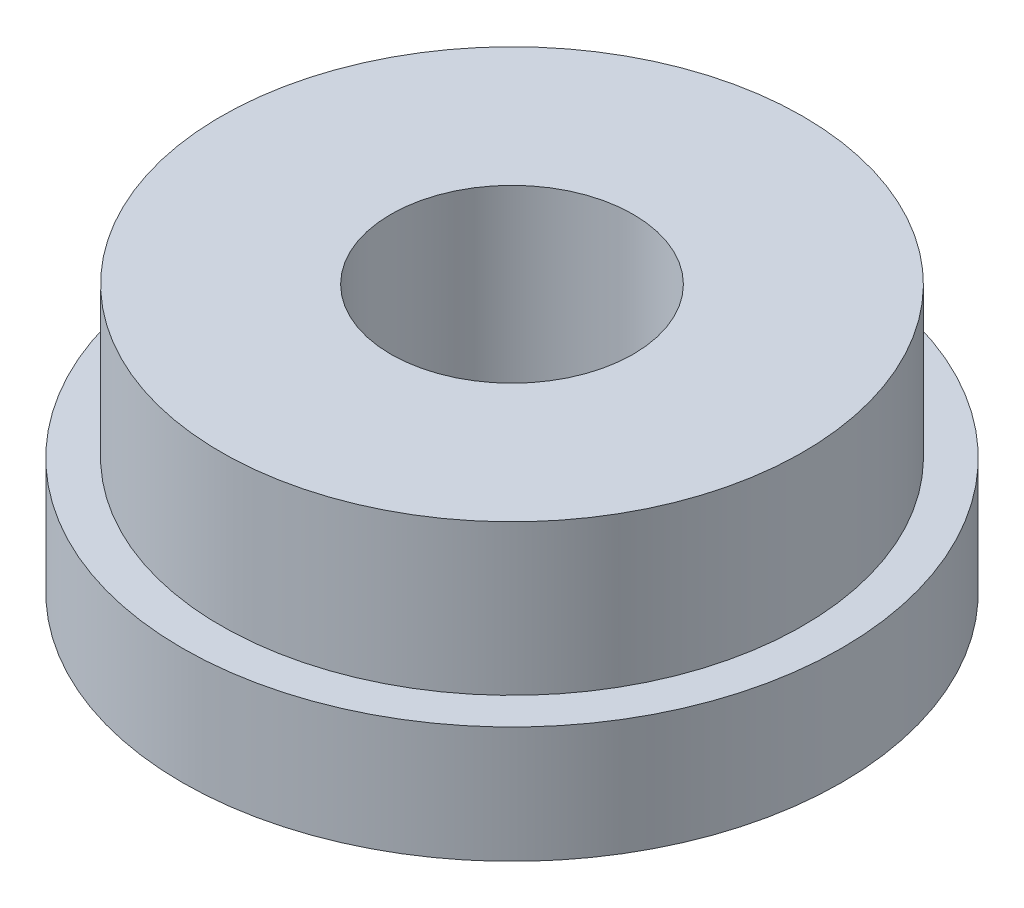
ISO-10303-21;
HEADER;
FILE_DESCRIPTION(('STEP AP214'),'2;1');
FILE_NAME('part.step','',(''),(''),'','','');
FILE_SCHEMA(('AUTOMOTIVE_DESIGN { 1 0 10303 214 1 1 1 1 }'));
ENDSEC;
DATA;
#1=APPLICATION_CONTEXT('core data for automotive mechanical design processes');
#2=APPLICATION_PROTOCOL_DEFINITION('international standard','automotive_design',2000,#1);
#3=PRODUCT_CONTEXT('',#1,'mechanical');
#4=PRODUCT('Part','Part','',(#3));
#5=PRODUCT_RELATED_PRODUCT_CATEGORY('part','',(#4));
#6=PRODUCT_DEFINITION_FORMATION('','',#4);
#7=PRODUCT_DEFINITION_CONTEXT('part definition',#1,'design');
#8=PRODUCT_DEFINITION('design','',#6,#7);
#9=PRODUCT_DEFINITION_SHAPE('','',#8);
#10=(LENGTH_UNIT() NAMED_UNIT(*) SI_UNIT(.MILLI.,.METRE.));
#11=(NAMED_UNIT(*) PLANE_ANGLE_UNIT() SI_UNIT($,.RADIAN.));
#12=(NAMED_UNIT(*) SI_UNIT($,.STERADIAN.) SOLID_ANGLE_UNIT());
#13=UNCERTAINTY_MEASURE_WITH_UNIT(LENGTH_MEASURE(1.E-05),#10,'distance_accuracy_value','');
#14=(GEOMETRIC_REPRESENTATION_CONTEXT(3) GLOBAL_UNCERTAINTY_ASSIGNED_CONTEXT((#13)) GLOBAL_UNIT_ASSIGNED_CONTEXT((#10,
#11,#12)) REPRESENTATION_CONTEXT('',''));
#15=CARTESIAN_POINT('',(0.,0.,0.));
#16=DIRECTION('',(0.,0.,1.));
#17=DIRECTION('',(1.,0.,0.));
#18=AXIS2_PLACEMENT_3D('',#15,#16,#17);
#19=CARTESIAN_POINT('',(3.4,0.,0.));
#20=DIRECTION('',(0.,-1.,0.));
#21=DIRECTION('',(0.,0.,-1.));
#22=AXIS2_PLACEMENT_3D('',#19,#20,#21);
#23=PLANE('',#22);
#24=CARTESIAN_POINT('',(0.,0.,0.));
#25=DIRECTION('',(0.,-1.,0.));
#26=DIRECTION('',(0.,0.,-1.));
#27=AXIS2_PLACEMENT_3D('',#24,#25,#26);
#28=CIRCLE('',#27,3.4);
#29=CARTESIAN_POINT('',(0.,0.,-3.4));
#30=VERTEX_POINT('',#29);
#31=EDGE_CURVE('E52',#30,#30,#28,.T.);
#32=ORIENTED_EDGE('',*,*,#31,.T.);
#33=EDGE_LOOP('',(#32));
#34=FACE_BOUND('',#33,.T.);
#35=CARTESIAN_POINT('',(0.,0.,0.));
#36=DIRECTION('',(0.,-1.,0.));
#37=DIRECTION('',(0.,0.,-1.));
#38=AXIS2_PLACEMENT_3D('',#35,#36,#37);
#39=CIRCLE('',#38,1.25);
#40=CARTESIAN_POINT('',(0.,0.,-1.25));
#41=VERTEX_POINT('',#40);
#42=EDGE_CURVE('E10',#41,#41,#39,.T.);
#43=ORIENTED_EDGE('',*,*,#42,.F.);
#44=EDGE_LOOP('',(#43));
#45=FACE_BOUND('',#44,.T.);
#46=ADVANCED_FACE('F30',(#34,#45),#23,.T.);
#47=CARTESIAN_POINT('',(0.,0.,0.));
#48=DIRECTION('',(0.,-1.,0.));
#49=DIRECTION('',(0.,0.,-1.));
#50=AXIS2_PLACEMENT_3D('',#47,#48,#49);
#51=CYLINDRICAL_SURFACE('',#50,1.25);
#52=ORIENTED_EDGE('',*,*,#42,.T.);
#53=EDGE_LOOP('',(#52));
#54=FACE_BOUND('',#53,.T.);
#55=CARTESIAN_POINT('',(0.,2.75,0.));
#56=DIRECTION('',(0.,-1.,0.));
#57=DIRECTION('',(0.,0.,-1.));
#58=AXIS2_PLACEMENT_3D('',#55,#56,#57);
#59=CIRCLE('',#58,1.25);
#60=CARTESIAN_POINT('',(0.,2.75,-1.25));
#61=VERTEX_POINT('',#60);
#62=EDGE_CURVE('E36',#61,#61,#59,.T.);
#63=ORIENTED_EDGE('',*,*,#62,.F.);
#64=EDGE_LOOP('',(#63));
#65=FACE_BOUND('',#64,.T.);
#66=ADVANCED_FACE('F70',(#54,#65),#51,.F.);
#67=CARTESIAN_POINT('',(1.25,2.75,0.));
#68=DIRECTION('',(0.,1.,0.));
#69=DIRECTION('',(0.,0.,1.));
#70=AXIS2_PLACEMENT_3D('',#67,#68,#69);
#71=PLANE('',#70);
#72=ORIENTED_EDGE('',*,*,#62,.T.);
#73=EDGE_LOOP('',(#72));
#74=FACE_BOUND('',#73,.T.);
#75=CARTESIAN_POINT('',(0.,2.75,0.));
#76=DIRECTION('',(0.,-1.,0.));
#77=DIRECTION('',(0.,0.,-1.));
#78=AXIS2_PLACEMENT_3D('',#75,#76,#77);
#79=CIRCLE('',#78,3.);
#80=CARTESIAN_POINT('',(0.,2.75,-3.));
#81=VERTEX_POINT('',#80);
#82=EDGE_CURVE('E40',#81,#81,#79,.T.);
#83=ORIENTED_EDGE('',*,*,#82,.F.);
#84=EDGE_LOOP('',(#83));
#85=FACE_BOUND('',#84,.T.);
#86=ADVANCED_FACE('F74',(#74,#85),#71,.T.);
#87=CARTESIAN_POINT('',(0.,0.,0.));
#88=DIRECTION('',(0.,-1.,0.));
#89=DIRECTION('',(0.,0.,-1.));
#90=AXIS2_PLACEMENT_3D('',#87,#88,#89);
#91=CYLINDRICAL_SURFACE('',#90,3.);
#92=ORIENTED_EDGE('',*,*,#82,.T.);
#93=EDGE_LOOP('',(#92));
#94=FACE_BOUND('',#93,.T.);
#95=CARTESIAN_POINT('',(0.,1.2,0.));
#96=DIRECTION('',(0.,-1.,0.));
#97=DIRECTION('',(0.,0.,-1.));
#98=AXIS2_PLACEMENT_3D('',#95,#96,#97);
#99=CIRCLE('',#98,3.);
#100=CARTESIAN_POINT('',(0.,1.2,-3.));
#101=VERTEX_POINT('',#100);
#102=EDGE_CURVE('E44',#101,#101,#99,.T.);
#103=ORIENTED_EDGE('',*,*,#102,.F.);
#104=EDGE_LOOP('',(#103));
#105=FACE_BOUND('',#104,.T.);
#106=ADVANCED_FACE('F66',(#94,#105),#91,.T.);
#107=CARTESIAN_POINT('',(3.,1.2,0.));
#108=DIRECTION('',(0.,1.,0.));
#109=DIRECTION('',(0.,0.,1.));
#110=AXIS2_PLACEMENT_3D('',#107,#108,#109);
#111=PLANE('',#110);
#112=ORIENTED_EDGE('',*,*,#102,.T.);
#113=EDGE_LOOP('',(#112));
#114=FACE_BOUND('',#113,.T.);
#115=CARTESIAN_POINT('',(0.,1.2,0.));
#116=DIRECTION('',(0.,-1.,0.));
#117=DIRECTION('',(0.,0.,-1.));
#118=AXIS2_PLACEMENT_3D('',#115,#116,#117);
#119=CIRCLE('',#118,3.4);
#120=CARTESIAN_POINT('',(0.,1.2,-3.4));
#121=VERTEX_POINT('',#120);
#122=EDGE_CURVE('E49',#121,#121,#119,.T.);
#123=ORIENTED_EDGE('',*,*,#122,.F.);
#124=EDGE_LOOP('',(#123));
#125=FACE_BOUND('',#124,.T.);
#126=ADVANCED_FACE('F60',(#114,#125),#111,.T.);
#127=CARTESIAN_POINT('',(0.,0.,0.));
#128=DIRECTION('',(0.,-1.,0.));
#129=DIRECTION('',(0.,0.,-1.));
#130=AXIS2_PLACEMENT_3D('',#127,#128,#129);
#131=CYLINDRICAL_SURFACE('',#130,3.4);
#132=ORIENTED_EDGE('',*,*,#122,.T.);
#133=EDGE_LOOP('',(#132));
#134=FACE_BOUND('',#133,.T.);
#135=ORIENTED_EDGE('',*,*,#31,.F.);
#136=EDGE_LOOP('',(#135));
#137=FACE_BOUND('',#136,.T.);
#138=ADVANCED_FACE('F58',(#134,#137),#131,.T.);
#139=CLOSED_SHELL('',(#46,#66,#86,#106,#126,#138));
#140=MANIFOLD_SOLID_BREP('B2',#139);
#141=ADVANCED_BREP_SHAPE_REPRESENTATION('',(#18,#140),#14);
#142=SHAPE_DEFINITION_REPRESENTATION(#9,#141);
ENDSEC;
END-ISO-10303-21;
